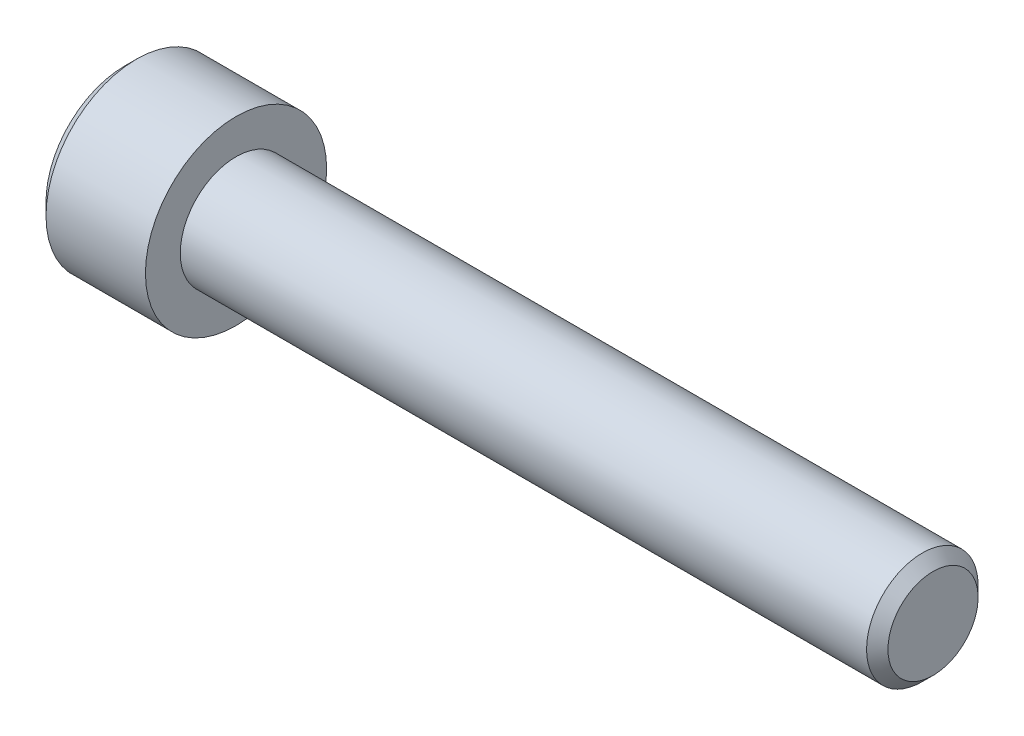
ISO-10303-21;
HEADER;
FILE_DESCRIPTION(('STEP AP214'),'2;1');
FILE_NAME('part.step','',(''),(''),'','','');
FILE_SCHEMA(('AUTOMOTIVE_DESIGN { 1 0 10303 214 1 1 1 1 }'));
ENDSEC;
DATA;
#1=APPLICATION_CONTEXT('core data for automotive mechanical design processes');
#2=APPLICATION_PROTOCOL_DEFINITION('international standard','automotive_design',2000,#1);
#3=PRODUCT_CONTEXT('',#1,'mechanical');
#4=PRODUCT('Part','Part','',(#3));
#5=PRODUCT_RELATED_PRODUCT_CATEGORY('part','',(#4));
#6=PRODUCT_DEFINITION_FORMATION('','',#4);
#7=PRODUCT_DEFINITION_CONTEXT('part definition',#1,'design');
#8=PRODUCT_DEFINITION('design','',#6,#7);
#9=PRODUCT_DEFINITION_SHAPE('','',#8);
#10=(LENGTH_UNIT() NAMED_UNIT(*) SI_UNIT(.MILLI.,.METRE.));
#11=(NAMED_UNIT(*) PLANE_ANGLE_UNIT() SI_UNIT($,.RADIAN.));
#12=(NAMED_UNIT(*) SI_UNIT($,.STERADIAN.) SOLID_ANGLE_UNIT());
#13=UNCERTAINTY_MEASURE_WITH_UNIT(LENGTH_MEASURE(1.E-05),#10,'distance_accuracy_value','');
#14=(GEOMETRIC_REPRESENTATION_CONTEXT(3) GLOBAL_UNCERTAINTY_ASSIGNED_CONTEXT((#13)) GLOBAL_UNIT_ASSIGNED_CONTEXT((#10,
#11,#12)) REPRESENTATION_CONTEXT('',''));
#15=CARTESIAN_POINT('',(0.,0.,0.));
#16=DIRECTION('',(0.,0.,1.));
#17=DIRECTION('',(1.,0.,0.));
#18=AXIS2_PLACEMENT_3D('',#15,#16,#17);
#19=CARTESIAN_POINT('',(-4.,0.,0.));
#20=DIRECTION('',(1.,0.,0.));
#21=DIRECTION('',(0.,0.,-1.));
#22=AXIS2_PLACEMENT_3D('',#19,#20,#21);
#23=PLANE('',#22);
#24=DIRECTION('',(0.,1.,0.));
#25=VECTOR('',#24,1.);
#26=CARTESIAN_POINT('',(-4.,0.,3.));
#27=LINE('',#26,#25);
#28=CARTESIAN_POINT('',(-4.,1.73205080756888,3.));
#29=VERTEX_POINT('',#28);
#30=CARTESIAN_POINT('',(-3.99999999999534,0.,2.99999999999295));
#31=VERTEX_POINT('',#30);
#32=EDGE_CURVE('E109',#29,#31,#27,.F.);
#33=ORIENTED_EDGE('',*,*,#32,.F.);
#34=DIRECTION('',(0.,-0.500000000000001,0.866025403784438));
#35=VECTOR('',#34,1.);
#36=CARTESIAN_POINT('',(-4.,2.59807621135332,1.5));
#37=LINE('',#36,#35);
#38=CARTESIAN_POINT('',(-3.99999999999534,2.59807621134721,1.49999999999647));
#39=VERTEX_POINT('',#38);
#40=EDGE_CURVE('E93',#39,#29,#37,.T.);
#41=ORIENTED_EDGE('',*,*,#40,.F.);
#42=CARTESIAN_POINT('',(-3.99999999999068,0.,0.));
#43=DIRECTION('',(-1.,0.,0.));
#44=DIRECTION('',(0.,0.,1.));
#45=AXIS2_PLACEMENT_3D('',#42,#43,#44);
#46=CIRCLE('',#45,2.9999999999859);
#47=EDGE_CURVE('E20',#39,#31,#46,.F.);
#48=ORIENTED_EDGE('',*,*,#47,.T.);
#49=EDGE_LOOP('',(#33,#41,#48));
#50=FACE_BOUND('',#49,.T.);
#51=ADVANCED_FACE('F17',(#50),#23,.F.);
#52=CARTESIAN_POINT('',(-4.,0.,0.));
#53=DIRECTION('',(1.,0.,0.));
#54=DIRECTION('',(0.,0.,-1.));
#55=AXIS2_PLACEMENT_3D('',#52,#53,#54);
#56=PLANE('',#55);
#57=DIRECTION('',(0.,0.499999999999996,-0.866025403784441));
#58=VECTOR('',#57,1.);
#59=CARTESIAN_POINT('',(-4.,-3.46410161513775,0.));
#60=LINE('',#59,#58);
#61=CARTESIAN_POINT('',(-4.,-3.46410161513775,0.));
#62=VERTEX_POINT('',#61);
#63=CARTESIAN_POINT('',(-3.99999999999534,-2.59807621134721,-1.49999999999648));
#64=VERTEX_POINT('',#63);
#65=EDGE_CURVE('E149',#62,#64,#60,.T.);
#66=ORIENTED_EDGE('',*,*,#65,.F.);
#67=DIRECTION('',(0.,-0.499999999999996,-0.866025403784441));
#68=VECTOR('',#67,1.);
#69=CARTESIAN_POINT('',(-4.,-2.59807621135332,1.5));
#70=LINE('',#69,#68);
#71=CARTESIAN_POINT('',(-3.99999999999534,-2.59807621134721,1.49999999999647));
#72=VERTEX_POINT('',#71);
#73=EDGE_CURVE('E153',#72,#62,#70,.T.);
#74=ORIENTED_EDGE('',*,*,#73,.F.);
#75=CARTESIAN_POINT('',(-3.99999999999068,0.,0.));
#76=DIRECTION('',(-1.,0.,0.));
#77=DIRECTION('',(0.,0.,1.));
#78=AXIS2_PLACEMENT_3D('',#75,#76,#77);
#79=CIRCLE('',#78,2.9999999999859);
#80=EDGE_CURVE('E123',#72,#64,#79,.F.);
#81=ORIENTED_EDGE('',*,*,#80,.T.);
#82=EDGE_LOOP('',(#66,#74,#81));
#83=FACE_BOUND('',#82,.T.);
#84=ADVANCED_FACE('F420',(#83),#56,.F.);
#85=CARTESIAN_POINT('',(-4.,0.,0.));
#86=DIRECTION('',(1.,0.,0.));
#87=DIRECTION('',(0.,0.,-1.));
#88=AXIS2_PLACEMENT_3D('',#85,#86,#87);
#89=PLANE('',#88);
#90=DIRECTION('',(0.,1.,0.));
#91=VECTOR('',#90,1.);
#92=CARTESIAN_POINT('',(-4.,0.,-3.));
#93=LINE('',#92,#91);
#94=CARTESIAN_POINT('',(-4.,-1.73205080756888,-3.));
#95=VERTEX_POINT('',#94);
#96=CARTESIAN_POINT('',(-3.99999999999534,0.,-2.99999999999295));
#97=VERTEX_POINT('',#96);
#98=EDGE_CURVE('E141',#95,#97,#93,.T.);
#99=ORIENTED_EDGE('',*,*,#98,.F.);
#100=DIRECTION('',(0.,0.500000000000001,-0.866025403784438));
#101=VECTOR('',#100,1.);
#102=CARTESIAN_POINT('',(-4.,-2.59807621135332,-1.5));
#103=LINE('',#102,#101);
#104=EDGE_CURVE('E145',#64,#95,#103,.T.);
#105=ORIENTED_EDGE('',*,*,#104,.F.);
#106=CARTESIAN_POINT('',(-3.99999999999068,0.,0.));
#107=DIRECTION('',(-1.,0.,0.));
#108=DIRECTION('',(0.,0.,1.));
#109=AXIS2_PLACEMENT_3D('',#106,#107,#108);
#110=CIRCLE('',#109,2.9999999999859);
#111=EDGE_CURVE('E125',#64,#97,#110,.F.);
#112=ORIENTED_EDGE('',*,*,#111,.T.);
#113=EDGE_LOOP('',(#99,#105,#112));
#114=FACE_BOUND('',#113,.T.);
#115=ADVANCED_FACE('F207',(#114),#89,.F.);
#116=CARTESIAN_POINT('',(-4.,0.,0.));
#117=DIRECTION('',(1.,0.,0.));
#118=DIRECTION('',(0.,0.,-1.));
#119=AXIS2_PLACEMENT_3D('',#116,#117,#118);
#120=PLANE('',#119);
#121=DIRECTION('',(0.,0.500000000000001,0.866025403784438));
#122=VECTOR('',#121,1.);
#123=CARTESIAN_POINT('',(-4.,1.73205080756888,-3.));
#124=LINE('',#123,#122);
#125=CARTESIAN_POINT('',(-4.,1.73205080756888,-3.));
#126=VERTEX_POINT('',#125);
#127=CARTESIAN_POINT('',(-3.99999999999534,2.59807621134721,-1.49999999999647));
#128=VERTEX_POINT('',#127);
#129=EDGE_CURVE('E101',#126,#128,#124,.T.);
#130=ORIENTED_EDGE('',*,*,#129,.F.);
#131=DIRECTION('',(0.,1.,0.));
#132=VECTOR('',#131,1.);
#133=CARTESIAN_POINT('',(-4.,0.,-3.));
#134=LINE('',#133,#132);
#135=EDGE_CURVE('E137',#97,#126,#134,.T.);
#136=ORIENTED_EDGE('',*,*,#135,.F.);
#137=CARTESIAN_POINT('',(-3.99999999999068,0.,0.));
#138=DIRECTION('',(-1.,0.,0.));
#139=DIRECTION('',(0.,0.,1.));
#140=AXIS2_PLACEMENT_3D('',#137,#138,#139);
#141=CIRCLE('',#140,2.9999999999859);
#142=EDGE_CURVE('E117',#97,#128,#141,.F.);
#143=ORIENTED_EDGE('',*,*,#142,.T.);
#144=EDGE_LOOP('',(#130,#136,#143));
#145=FACE_BOUND('',#144,.T.);
#146=ADVANCED_FACE('F210',(#145),#120,.F.);
#147=CARTESIAN_POINT('',(-4.,0.,0.));
#148=DIRECTION('',(1.,0.,0.));
#149=DIRECTION('',(0.,0.,-1.));
#150=AXIS2_PLACEMENT_3D('',#147,#148,#149);
#151=PLANE('',#150);
#152=CARTESIAN_POINT('',(-3.99999999999068,0.,0.));
#153=DIRECTION('',(-1.,0.,0.));
#154=DIRECTION('',(0.,0.,1.));
#155=AXIS2_PLACEMENT_3D('',#152,#153,#154);
#156=CIRCLE('',#155,2.9999999999859);
#157=EDGE_CURVE('E112',#128,#39,#156,.F.);
#158=ORIENTED_EDGE('',*,*,#157,.T.);
#159=DIRECTION('',(0.,-0.499999999999996,0.866025403784441));
#160=VECTOR('',#159,1.);
#161=CARTESIAN_POINT('',(-4.,3.46410161513775,0.));
#162=LINE('',#161,#160);
#163=CARTESIAN_POINT('',(-4.,3.46410161513775,0.));
#164=VERTEX_POINT('',#163);
#165=EDGE_CURVE('E89',#164,#39,#162,.T.);
#166=ORIENTED_EDGE('',*,*,#165,.F.);
#167=DIRECTION('',(0.,0.499999999999996,0.866025403784441));
#168=VECTOR('',#167,1.);
#169=CARTESIAN_POINT('',(-4.,2.59807621135332,-1.5));
#170=LINE('',#169,#168);
#171=EDGE_CURVE('E100',#128,#164,#170,.T.);
#172=ORIENTED_EDGE('',*,*,#171,.F.);
#173=EDGE_LOOP('',(#158,#166,#172));
#174=FACE_BOUND('',#173,.T.);
#175=ADVANCED_FACE('F113',(#174),#151,.F.);
#176=CARTESIAN_POINT('',(-3.99999999999068,0.,0.));
#177=DIRECTION('',(-1.,0.,0.));
#178=DIRECTION('',(0.,0.,1.));
#179=AXIS2_PLACEMENT_3D('',#176,#177,#178);
#180=CONICAL_SURFACE('',#179,2.9999999999859,1.30899693900041);
#181=CARTESIAN_POINT('',(-3.1961524227313,0.,5.6843418860808E-11));
#182=VERTEX_POINT('',#181);
#183=VERTEX_LOOP('',#182);
#184=FACE_BOUND('',#183,.T.);
#185=ORIENTED_EDGE('',*,*,#142,.F.);
#186=ORIENTED_EDGE('',*,*,#111,.F.);
#187=ORIENTED_EDGE('',*,*,#80,.F.);
#188=CARTESIAN_POINT('',(-3.99999999999068,0.,0.));
#189=DIRECTION('',(-1.,0.,0.));
#190=DIRECTION('',(0.,0.,1.));
#191=AXIS2_PLACEMENT_3D('',#188,#189,#190);
#192=CIRCLE('',#191,2.9999999999859);
#193=EDGE_CURVE('E116',#72,#31,#192,.T.);
#194=ORIENTED_EDGE('',*,*,#193,.T.);
#195=ORIENTED_EDGE('',*,*,#47,.F.);
#196=ORIENTED_EDGE('',*,*,#157,.F.);
#197=EDGE_LOOP('',(#185,#186,#187,#194,#195,#196));
#198=FACE_BOUND('',#197,.T.);
#199=ADVANCED_FACE('F119',(#184,#198),#180,.F.);
#200=CARTESIAN_POINT('',(-4.,0.,0.));
#201=DIRECTION('',(1.,0.,0.));
#202=DIRECTION('',(0.,0.,-1.));
#203=AXIS2_PLACEMENT_3D('',#200,#201,#202);
#204=PLANE('',#203);
#205=DIRECTION('',(0.,0.5,0.866025403784439));
#206=VECTOR('',#205,1.);
#207=CARTESIAN_POINT('',(-4.,-1.73205080756888,3.));
#208=LINE('',#207,#206);
#209=CARTESIAN_POINT('',(-4.,-1.73205080756888,3.));
#210=VERTEX_POINT('',#209);
#211=EDGE_CURVE('E197',#210,#72,#208,.F.);
#212=ORIENTED_EDGE('',*,*,#211,.F.);
#213=DIRECTION('',(0.,1.,0.));
#214=VECTOR('',#213,1.);
#215=CARTESIAN_POINT('',(-4.,1.73205080756888,3.));
#216=LINE('',#215,#214);
#217=EDGE_CURVE('E227',#31,#210,#216,.F.);
#218=ORIENTED_EDGE('',*,*,#217,.F.);
#219=ORIENTED_EDGE('',*,*,#193,.F.);
#220=EDGE_LOOP('',(#212,#218,#219));
#221=FACE_BOUND('',#220,.T.);
#222=ADVANCED_FACE('F240',(#221),#204,.F.);
#223=CARTESIAN_POINT('',(-4.,-1.73205080756888,3.));
#224=DIRECTION('',(0.,0.866025403784439,-0.5));
#225=DIRECTION('',(0.,0.5,0.866025403784439));
#226=AXIS2_PLACEMENT_3D('',#223,#224,#225);
#227=PLANE('',#226);
#228=ORIENTED_EDGE('',*,*,#73,.T.);
#229=DIRECTION('',(1.,0.,0.));
#230=VECTOR('',#229,1.);
#231=CARTESIAN_POINT('',(-4.,-3.46410161513775,0.));
#232=LINE('',#231,#230);
#233=CARTESIAN_POINT('',(-8.,-3.46410161513775,0.));
#234=VERTEX_POINT('',#233);
#235=EDGE_CURVE('E170',#234,#62,#232,.T.);
#236=ORIENTED_EDGE('',*,*,#235,.F.);
#237=DIRECTION('',(0.,0.499999999999998,0.86602540378444));
#238=VECTOR('',#237,1.);
#239=CARTESIAN_POINT('',(-8.,-3.46410161513775,0.));
#240=LINE('',#239,#238);
#241=CARTESIAN_POINT('',(-8.,-1.73205080756888,3.));
#242=VERTEX_POINT('',#241);
#243=EDGE_CURVE('E175',#234,#242,#240,.T.);
#244=ORIENTED_EDGE('',*,*,#243,.T.);
#245=DIRECTION('',(-1.,0.,0.));
#246=VECTOR('',#245,1.);
#247=CARTESIAN_POINT('',(-4.,-1.73205080756888,3.));
#248=LINE('',#247,#246);
#249=EDGE_CURVE('E183',#210,#242,#248,.T.);
#250=ORIENTED_EDGE('',*,*,#249,.F.);
#251=ORIENTED_EDGE('',*,*,#211,.T.);
#252=EDGE_LOOP('',(#228,#236,#244,#250,#251));
#253=FACE_BOUND('',#252,.T.);
#254=ADVANCED_FACE('F238',(#253),#227,.T.);
#255=CARTESIAN_POINT('',(-4.,1.73205080756888,3.));
#256=DIRECTION('',(0.,0.,-1.));
#257=DIRECTION('',(-1.,0.,0.));
#258=AXIS2_PLACEMENT_3D('',#255,#256,#257);
#259=PLANE('',#258);
#260=ORIENTED_EDGE('',*,*,#217,.T.);
#261=ORIENTED_EDGE('',*,*,#249,.T.);
#262=DIRECTION('',(0.,1.,0.));
#263=VECTOR('',#262,1.);
#264=CARTESIAN_POINT('',(-8.,0.,3.));
#265=LINE('',#264,#263);
#266=CARTESIAN_POINT('',(-8.,1.73205080756888,3.));
#267=VERTEX_POINT('',#266);
#268=EDGE_CURVE('E221',#242,#267,#265,.T.);
#269=ORIENTED_EDGE('',*,*,#268,.T.);
#270=DIRECTION('',(1.,0.,0.));
#271=VECTOR('',#270,1.);
#272=CARTESIAN_POINT('',(-4.,1.73205080756887,3.));
#273=LINE('',#272,#271);
#274=EDGE_CURVE('E166',#29,#267,#273,.F.);
#275=ORIENTED_EDGE('',*,*,#274,.F.);
#276=ORIENTED_EDGE('',*,*,#32,.T.);
#277=EDGE_LOOP('',(#260,#261,#269,#275,#276));
#278=FACE_BOUND('',#277,.T.);
#279=ADVANCED_FACE('F242',(#278),#259,.T.);
#280=CARTESIAN_POINT('',(-4.,3.46410161513775,0.));
#281=DIRECTION('',(0.,-0.866025403784439,-0.5));
#282=DIRECTION('',(0.,0.5,-0.866025403784439));
#283=AXIS2_PLACEMENT_3D('',#280,#281,#282);
#284=PLANE('',#283);
#285=ORIENTED_EDGE('',*,*,#40,.T.);
#286=ORIENTED_EDGE('',*,*,#274,.T.);
#287=DIRECTION('',(0.,0.499999999999998,-0.86602540378444));
#288=VECTOR('',#287,1.);
#289=CARTESIAN_POINT('',(-8.,1.73205080756888,3.));
#290=LINE('',#289,#288);
#291=CARTESIAN_POINT('',(-8.,3.46410161513775,0.));
#292=VERTEX_POINT('',#291);
#293=EDGE_CURVE('E218',#267,#292,#290,.T.);
#294=ORIENTED_EDGE('',*,*,#293,.T.);
#295=DIRECTION('',(1.,0.,0.));
#296=VECTOR('',#295,1.);
#297=CARTESIAN_POINT('',(-4.,3.46410161513776,0.));
#298=LINE('',#297,#296);
#299=EDGE_CURVE('E96',#164,#292,#298,.F.);
#300=ORIENTED_EDGE('',*,*,#299,.F.);
#301=ORIENTED_EDGE('',*,*,#165,.T.);
#302=EDGE_LOOP('',(#285,#286,#294,#300,#301));
#303=FACE_BOUND('',#302,.T.);
#304=ADVANCED_FACE('F91',(#303),#284,.T.);
#305=CARTESIAN_POINT('',(-4.,1.73205080756888,-3.));
#306=DIRECTION('',(0.,-0.866025403784439,0.5));
#307=DIRECTION('',(0.,-0.5,-0.866025403784439));
#308=AXIS2_PLACEMENT_3D('',#305,#306,#307);
#309=PLANE('',#308);
#310=ORIENTED_EDGE('',*,*,#171,.T.);
#311=ORIENTED_EDGE('',*,*,#299,.T.);
#312=DIRECTION('',(0.,-0.499999999999998,-0.86602540378444));
#313=VECTOR('',#312,1.);
#314=CARTESIAN_POINT('',(-8.,3.46410161513775,0.));
#315=LINE('',#314,#313);
#316=CARTESIAN_POINT('',(-8.,1.73205080756888,-3.));
#317=VERTEX_POINT('',#316);
#318=EDGE_CURVE('E215',#292,#317,#315,.T.);
#319=ORIENTED_EDGE('',*,*,#318,.T.);
#320=DIRECTION('',(1.,0.,0.));
#321=VECTOR('',#320,1.);
#322=CARTESIAN_POINT('',(-4.,1.73205080756888,-3.));
#323=LINE('',#322,#321);
#324=EDGE_CURVE('E165',#126,#317,#323,.F.);
#325=ORIENTED_EDGE('',*,*,#324,.F.);
#326=ORIENTED_EDGE('',*,*,#129,.T.);
#327=EDGE_LOOP('',(#310,#311,#319,#325,#326));
#328=FACE_BOUND('',#327,.T.);
#329=ADVANCED_FACE('F213',(#328),#309,.T.);
#330=CARTESIAN_POINT('',(-4.,-1.73205080756888,-3.));
#331=DIRECTION('',(0.,0.,1.));
#332=DIRECTION('',(1.,0.,0.));
#333=AXIS2_PLACEMENT_3D('',#330,#331,#332);
#334=PLANE('',#333);
#335=ORIENTED_EDGE('',*,*,#135,.T.);
#336=ORIENTED_EDGE('',*,*,#324,.T.);
#337=DIRECTION('',(0.,1.,0.));
#338=VECTOR('',#337,1.);
#339=CARTESIAN_POINT('',(-8.,0.,-3.));
#340=LINE('',#339,#338);
#341=CARTESIAN_POINT('',(-8.,-1.73205080756888,-3.));
#342=VERTEX_POINT('',#341);
#343=EDGE_CURVE('E35',#317,#342,#340,.F.);
#344=ORIENTED_EDGE('',*,*,#343,.T.);
#345=DIRECTION('',(1.,0.,0.));
#346=VECTOR('',#345,1.);
#347=CARTESIAN_POINT('',(-4.,-1.73205080756887,-3.));
#348=LINE('',#347,#346);
#349=EDGE_CURVE('E173',#95,#342,#348,.F.);
#350=ORIENTED_EDGE('',*,*,#349,.F.);
#351=ORIENTED_EDGE('',*,*,#98,.T.);
#352=EDGE_LOOP('',(#335,#336,#344,#350,#351));
#353=FACE_BOUND('',#352,.T.);
#354=ADVANCED_FACE('F212',(#353),#334,.T.);
#355=CARTESIAN_POINT('',(-4.,-3.46410161513775,0.));
#356=DIRECTION('',(0.,0.866025403784439,0.5));
#357=DIRECTION('',(0.,-0.5,0.866025403784439));
#358=AXIS2_PLACEMENT_3D('',#355,#356,#357);
#359=PLANE('',#358);
#360=ORIENTED_EDGE('',*,*,#104,.T.);
#361=ORIENTED_EDGE('',*,*,#349,.T.);
#362=DIRECTION('',(0.,-0.499999999999998,0.86602540378444));
#363=VECTOR('',#362,1.);
#364=CARTESIAN_POINT('',(-8.,-1.73205080756888,-3.));
#365=LINE('',#364,#363);
#366=EDGE_CURVE('E196',#342,#234,#365,.T.);
#367=ORIENTED_EDGE('',*,*,#366,.T.);
#368=ORIENTED_EDGE('',*,*,#235,.T.);
#369=ORIENTED_EDGE('',*,*,#65,.T.);
#370=EDGE_LOOP('',(#360,#361,#367,#368,#369));
#371=FACE_BOUND('',#370,.T.);
#372=ADVANCED_FACE('F251',(#371),#359,.T.);
#373=CARTESIAN_POINT('',(-8.,0.,0.));
#374=DIRECTION('',(1.,0.,0.));
#375=DIRECTION('',(0.,0.,-1.));
#376=AXIS2_PLACEMENT_3D('',#373,#374,#375);
#377=PLANE('',#376);
#378=ORIENTED_EDGE('',*,*,#343,.F.);
#379=ORIENTED_EDGE('',*,*,#318,.F.);
#380=ORIENTED_EDGE('',*,*,#293,.F.);
#381=ORIENTED_EDGE('',*,*,#268,.F.);
#382=ORIENTED_EDGE('',*,*,#243,.F.);
#383=ORIENTED_EDGE('',*,*,#366,.F.);
#384=EDGE_LOOP('',(#378,#379,#380,#381,#382,#383));
#385=FACE_BOUND('',#384,.T.);
#386=CARTESIAN_POINT('',(-7.99999999998136,0.,0.));
#387=DIRECTION('',(1.,0.,0.));
#388=DIRECTION('',(0.,1.,0.));
#389=AXIS2_PLACEMENT_3D('',#386,#387,#388);
#390=CIRCLE('',#389,5.63333333326455);
#391=CARTESIAN_POINT('',(-7.99999999998136,5.63333333326455,0.));
#392=VERTEX_POINT('',#391);
#393=EDGE_CURVE('E193',#392,#392,#390,.T.);
#394=ORIENTED_EDGE('',*,*,#393,.F.);
#395=EDGE_LOOP('',(#394));
#396=FACE_BOUND('',#395,.T.);
#397=ADVANCED_FACE('F244',(#385,#396),#377,.F.);
#398=CARTESIAN_POINT('',(-7.13333333339961,0.,0.));
#399=DIRECTION('',(1.,0.,0.));
#400=DIRECTION('',(0.,1.,0.));
#401=AXIS2_PLACEMENT_3D('',#398,#399,#400);
#402=CONICAL_SURFACE('',#401,6.4999999998463,0.785398163397448);
#403=ORIENTED_EDGE('',*,*,#393,.T.);
#404=EDGE_LOOP('',(#403));
#405=FACE_BOUND('',#404,.T.);
#406=CARTESIAN_POINT('',(-7.13333333333333,0.,0.));
#407=DIRECTION('',(-1.,0.,0.));
#408=DIRECTION('',(0.,0.,1.));
#409=AXIS2_PLACEMENT_3D('',#406,#407,#408);
#410=CIRCLE('',#409,6.5);
#411=CARTESIAN_POINT('',(-7.13333333333333,0.,6.5));
#412=VERTEX_POINT('',#411);
#413=EDGE_CURVE('E192',#412,#412,#410,.F.);
#414=ORIENTED_EDGE('',*,*,#413,.F.);
#415=EDGE_LOOP('',(#414));
#416=FACE_BOUND('',#415,.T.);
#417=ADVANCED_FACE('F274',(#405,#416),#402,.T.);
#418=CARTESIAN_POINT('',(50.,3.233,0.));
#419=DIRECTION('',(-1.,0.,0.));
#420=DIRECTION('',(0.,0.,1.));
#421=AXIS2_PLACEMENT_3D('',#418,#419,#420);
#422=PLANE('',#421);
#423=CARTESIAN_POINT('',(49.9999999999545,0.,0.));
#424=DIRECTION('',(-1.,0.,0.));
#425=DIRECTION('',(0.,0.,1.));
#426=AXIS2_PLACEMENT_3D('',#423,#424,#425);
#427=CIRCLE('',#426,3.23300000002291);
#428=CARTESIAN_POINT('',(49.9999999999545,0.,3.23300000002291));
#429=VERTEX_POINT('',#428);
#430=EDGE_CURVE('E189',#429,#429,#427,.T.);
#431=ORIENTED_EDGE('',*,*,#430,.F.);
#432=EDGE_LOOP('',(#431));
#433=FACE_BOUND('',#432,.T.);
#434=ADVANCED_FACE('F272',(#433),#422,.F.);
#435=CARTESIAN_POINT('',(50.,0.,0.));
#436=DIRECTION('',(-1.,0.,0.));
#437=DIRECTION('',(0.,0.,1.));
#438=AXIS2_PLACEMENT_3D('',#435,#436,#437);
#439=CYLINDRICAL_SURFACE('',#438,6.5);
#440=ORIENTED_EDGE('',*,*,#413,.T.);
#441=EDGE_LOOP('',(#440));
#442=FACE_BOUND('',#441,.T.);
#443=CARTESIAN_POINT('',(0.,0.,0.));
#444=DIRECTION('',(-1.,0.,0.));
#445=DIRECTION('',(0.,0.,1.));
#446=AXIS2_PLACEMENT_3D('',#443,#444,#445);
#447=CIRCLE('',#446,6.5);
#448=CARTESIAN_POINT('',(0.,0.,6.5));
#449=VERTEX_POINT('',#448);
#450=EDGE_CURVE('E186',#449,#449,#447,.T.);
#451=ORIENTED_EDGE('',*,*,#450,.T.);
#452=EDGE_LOOP('',(#451));
#453=FACE_BOUND('',#452,.T.);
#454=ADVANCED_FACE('F268',(#442,#453),#439,.T.);
#455=CARTESIAN_POINT('',(49.2330000000152,0.,0.));
#456=DIRECTION('',(-1.,0.,0.));
#457=DIRECTION('',(0.,0.,1.));
#458=AXIS2_PLACEMENT_3D('',#455,#456,#457);
#459=CONICAL_SURFACE('',#458,3.99999999996226,0.785398163397448);
#460=CARTESIAN_POINT('',(49.233,0.,0.));
#461=DIRECTION('',(-1.,0.,0.));
#462=DIRECTION('',(0.,0.,1.));
#463=AXIS2_PLACEMENT_3D('',#460,#461,#462);
#464=CIRCLE('',#463,4.);
#465=CARTESIAN_POINT('',(49.233,0.,4.));
#466=VERTEX_POINT('',#465);
#467=EDGE_CURVE('E26',#466,#466,#464,.T.);
#468=ORIENTED_EDGE('',*,*,#467,.F.);
#469=EDGE_LOOP('',(#468));
#470=FACE_BOUND('',#469,.T.);
#471=ORIENTED_EDGE('',*,*,#430,.T.);
#472=EDGE_LOOP('',(#471));
#473=FACE_BOUND('',#472,.T.);
#474=ADVANCED_FACE('F264',(#470,#473),#459,.T.);
#475=CARTESIAN_POINT('',(0.,6.5,0.));
#476=DIRECTION('',(-1.,0.,0.));
#477=DIRECTION('',(0.,0.,1.));
#478=AXIS2_PLACEMENT_3D('',#475,#476,#477);
#479=PLANE('',#478);
#480=ORIENTED_EDGE('',*,*,#450,.F.);
#481=EDGE_LOOP('',(#480));
#482=FACE_BOUND('',#481,.T.);
#483=CARTESIAN_POINT('',(0.,0.,0.));
#484=DIRECTION('',(-1.,0.,0.));
#485=DIRECTION('',(0.,0.,1.));
#486=AXIS2_PLACEMENT_3D('',#483,#484,#485);
#487=CIRCLE('',#486,4.);
#488=CARTESIAN_POINT('',(0.,0.,4.));
#489=VERTEX_POINT('',#488);
#490=EDGE_CURVE('E11',#489,#489,#487,.F.);
#491=ORIENTED_EDGE('',*,*,#490,.F.);
#492=EDGE_LOOP('',(#491));
#493=FACE_BOUND('',#492,.T.);
#494=ADVANCED_FACE('F267',(#482,#493),#479,.F.);
#495=CARTESIAN_POINT('',(50.,0.,0.));
#496=DIRECTION('',(-1.,0.,0.));
#497=DIRECTION('',(0.,0.,1.));
#498=AXIS2_PLACEMENT_3D('',#495,#496,#497);
#499=CYLINDRICAL_SURFACE('',#498,4.);
#500=ORIENTED_EDGE('',*,*,#490,.T.);
#501=EDGE_LOOP('',(#500));
#502=FACE_BOUND('',#501,.T.);
#503=ORIENTED_EDGE('',*,*,#467,.T.);
#504=EDGE_LOOP('',(#503));
#505=FACE_BOUND('',#504,.T.);
#506=ADVANCED_FACE('F262',(#502,#505),#499,.T.);
#507=CLOSED_SHELL('',(#51,#84,#115,#146,#175,#199,#222,#254,#279,#304,#329,#354,#372,#397,#417,
#434,#454,#474,#494,#506));
#508=MANIFOLD_SOLID_BREP('B1',#507);
#509=ADVANCED_BREP_SHAPE_REPRESENTATION('',(#18,#508),#14);
#510=SHAPE_DEFINITION_REPRESENTATION(#9,#509);
ENDSEC;
END-ISO-10303-21;
